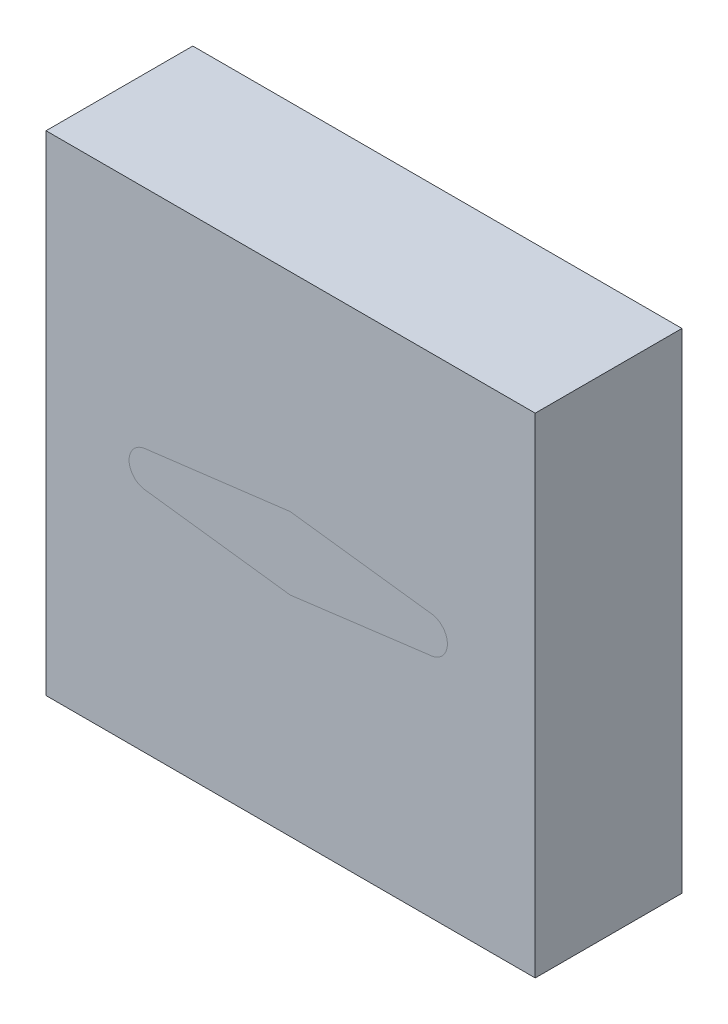
ISO-10303-21;
HEADER;
FILE_DESCRIPTION(('STEP AP214'),'2;1');
FILE_NAME('part.step','',(''),(''),'','','');
FILE_SCHEMA(('AUTOMOTIVE_DESIGN { 1 0 10303 214 1 1 1 1 }'));
ENDSEC;
DATA;
#1=APPLICATION_CONTEXT('core data for automotive mechanical design processes');
#2=APPLICATION_PROTOCOL_DEFINITION('international standard','automotive_design',2000,#1);
#3=PRODUCT_CONTEXT('',#1,'mechanical');
#4=PRODUCT('Part','Part','',(#3));
#5=PRODUCT_RELATED_PRODUCT_CATEGORY('part','',(#4));
#6=PRODUCT_DEFINITION_FORMATION('','',#4);
#7=PRODUCT_DEFINITION_CONTEXT('part definition',#1,'design');
#8=PRODUCT_DEFINITION('design','',#6,#7);
#9=PRODUCT_DEFINITION_SHAPE('','',#8);
#10=(LENGTH_UNIT() NAMED_UNIT(*) SI_UNIT(.MILLI.,.METRE.));
#11=(NAMED_UNIT(*) PLANE_ANGLE_UNIT() SI_UNIT($,.RADIAN.));
#12=(NAMED_UNIT(*) SI_UNIT($,.STERADIAN.) SOLID_ANGLE_UNIT());
#13=UNCERTAINTY_MEASURE_WITH_UNIT(LENGTH_MEASURE(1.E-05),#10,'distance_accuracy_value','');
#14=(GEOMETRIC_REPRESENTATION_CONTEXT(3) GLOBAL_UNCERTAINTY_ASSIGNED_CONTEXT((#13)) GLOBAL_UNIT_ASSIGNED_CONTEXT((#10,
#11,#12)) REPRESENTATION_CONTEXT('',''));
#15=CARTESIAN_POINT('',(0.,0.,0.));
#16=DIRECTION('',(0.,0.,1.));
#17=DIRECTION('',(1.,0.,0.));
#18=AXIS2_PLACEMENT_3D('',#15,#16,#17);
#19=CARTESIAN_POINT('',(14.1359581205412,0.0793616319379534,5.));
#20=DIRECTION('',(0.,0.,1.));
#21=DIRECTION('',(1.,0.,0.));
#22=AXIS2_PLACEMENT_3D('',#19,#20,#21);
#23=CYLINDRICAL_SURFACE('',#22,1.89099625638504);
#24=CARTESIAN_POINT('',(14.1359581205412,0.0793616319379534,15.));
#25=DIRECTION('',(0.,0.,1.));
#26=DIRECTION('',(1.,0.,0.));
#27=AXIS2_PLACEMENT_3D('',#24,#25,#26);
#28=CIRCLE('',#27,1.89099625638504);
#29=CARTESIAN_POINT('',(14.1639756358805,-1.8114270554876,15.));
#30=VERTEX_POINT('',#29);
#31=CARTESIAN_POINT('',(14.1404740770378,1.97035249595585,15.));
#32=VERTEX_POINT('',#31);
#33=EDGE_CURVE('E133',#30,#32,#28,.T.);
#34=ORIENTED_EDGE('',*,*,#33,.F.);
#35=DIRECTION('',(0.,0.,1.));
#36=VECTOR('',#35,1.);
#37=CARTESIAN_POINT('',(14.1639756358805,-1.8114270554876,5.));
#38=LINE('',#37,#36);
#39=CARTESIAN_POINT('',(14.1639756358805,-1.8114270554876,5.));
#40=VERTEX_POINT('',#39);
#41=EDGE_CURVE('E12',#40,#30,#38,.T.);
#42=ORIENTED_EDGE('',*,*,#41,.F.);
#43=CARTESIAN_POINT('',(14.1359581205412,0.0793616319379534,5.));
#44=DIRECTION('',(0.,0.,1.));
#45=DIRECTION('',(1.,0.,0.));
#46=AXIS2_PLACEMENT_3D('',#43,#44,#45);
#47=CIRCLE('',#46,1.89099625638504);
#48=CARTESIAN_POINT('',(14.1404740770378,1.97035249595585,5.));
#49=VERTEX_POINT('',#48);
#50=EDGE_CURVE('E147',#40,#49,#47,.T.);
#51=ORIENTED_EDGE('',*,*,#50,.T.);
#52=DIRECTION('',(0.,0.,1.));
#53=VECTOR('',#52,1.);
#54=CARTESIAN_POINT('',(14.1404740770378,1.97035249595585,5.));
#55=LINE('',#54,#53);
#56=EDGE_CURVE('E51',#49,#32,#55,.T.);
#57=ORIENTED_EDGE('',*,*,#56,.T.);
#58=EDGE_LOOP('',(#34,#42,#51,#57));
#59=FACE_BOUND('',#58,.T.);
#60=ADVANCED_FACE('F48',(#59),#23,.T.);
#61=CARTESIAN_POINT('',(-0.0477755509189492,-3.62218398577053,5.));
#62=DIRECTION('',(0.126390870058841,-0.991980517936602,0.));
#63=DIRECTION('',(0.991980517936602,0.126390870058841,0.));
#64=AXIS2_PLACEMENT_3D('',#61,#62,#63);
#65=PLANE('',#64);
#66=DIRECTION('',(0.991980517936602,0.126390870058841,0.));
#67=VECTOR('',#66,1.);
#68=CARTESIAN_POINT('',(-0.0477755509189492,-3.62218398577053,15.));
#69=LINE('',#68,#67);
#70=CARTESIAN_POINT('',(-0.0477755509189492,-3.62218398577053,15.));
#71=VERTEX_POINT('',#70);
#72=EDGE_CURVE('E145',#71,#30,#69,.T.);
#73=ORIENTED_EDGE('',*,*,#72,.F.);
#74=DIRECTION('',(0.,0.,1.));
#75=VECTOR('',#74,1.);
#76=CARTESIAN_POINT('',(-0.0477755509189492,-3.62218398577053,5.));
#77=LINE('',#76,#75);
#78=CARTESIAN_POINT('',(-0.0477755509189492,-3.62218398577053,5.));
#79=VERTEX_POINT('',#78);
#80=EDGE_CURVE('E57',#79,#71,#77,.T.);
#81=ORIENTED_EDGE('',*,*,#80,.F.);
#82=DIRECTION('',(0.991980517936602,0.126390870058841,0.));
#83=VECTOR('',#82,1.);
#84=CARTESIAN_POINT('',(-0.0477755509189492,-3.62218398577053,5.));
#85=LINE('',#84,#83);
#86=EDGE_CURVE('E123',#79,#40,#85,.T.);
#87=ORIENTED_EDGE('',*,*,#86,.T.);
#88=ORIENTED_EDGE('',*,*,#41,.T.);
#89=EDGE_LOOP('',(#73,#81,#87,#88));
#90=FACE_BOUND('',#89,.T.);
#91=ADVANCED_FACE('F155',(#90),#65,.T.);
#92=CARTESIAN_POINT('',(-14.7859527760631,-1.74496373019458,5.));
#93=DIRECTION('',(-0.126350467559565,-0.991985664890113,0.));
#94=DIRECTION('',(0.991985664890113,-0.126350467559565,0.));
#95=AXIS2_PLACEMENT_3D('',#92,#93,#94);
#96=PLANE('',#95);
#97=DIRECTION('',(0.991985664890113,-0.126350467559565,0.));
#98=VECTOR('',#97,1.);
#99=CARTESIAN_POINT('',(-14.7859527760631,-1.74496373019458,15.));
#100=LINE('',#99,#98);
#101=CARTESIAN_POINT('',(-14.7859527760631,-1.74496373019458,15.));
#102=VERTEX_POINT('',#101);
#103=EDGE_CURVE('E110',#102,#71,#100,.T.);
#104=ORIENTED_EDGE('',*,*,#103,.F.);
#105=DIRECTION('',(0.,0.,1.));
#106=VECTOR('',#105,1.);
#107=CARTESIAN_POINT('',(-14.7859527760631,-1.74496373019458,5.));
#108=LINE('',#107,#106);
#109=CARTESIAN_POINT('',(-14.7859527760631,-1.74496373019458,5.));
#110=VERTEX_POINT('',#109);
#111=EDGE_CURVE('E105',#110,#102,#108,.T.);
#112=ORIENTED_EDGE('',*,*,#111,.F.);
#113=DIRECTION('',(0.991985664890113,-0.126350467559565,0.));
#114=VECTOR('',#113,1.);
#115=CARTESIAN_POINT('',(-14.7859527760631,-1.74496373019458,5.));
#116=LINE('',#115,#114);
#117=EDGE_CURVE('E108',#110,#79,#116,.T.);
#118=ORIENTED_EDGE('',*,*,#117,.T.);
#119=ORIENTED_EDGE('',*,*,#80,.T.);
#120=EDGE_LOOP('',(#104,#112,#118,#119));
#121=FACE_BOUND('',#120,.T.);
#122=ADVANCED_FACE('F107',(#121),#96,.T.);
#123=CARTESIAN_POINT('',(-14.671886631999,0.0920626567636126,5.));
#124=DIRECTION('',(0.,0.,1.));
#125=DIRECTION('',(1.,0.,0.));
#126=AXIS2_PLACEMENT_3D('',#123,#124,#125);
#127=CYLINDRICAL_SURFACE('',#126,1.84056432422296);
#128=CARTESIAN_POINT('',(-14.671886631999,0.0920626567636126,15.));
#129=DIRECTION('',(0.,0.,1.));
#130=DIRECTION('',(1.,0.,0.));
#131=AXIS2_PLACEMENT_3D('',#128,#129,#130);
#132=CIRCLE('',#131,1.84056432422296);
#133=CARTESIAN_POINT('',(-14.8211705106121,1.92656295798696,15.));
#134=VERTEX_POINT('',#133);
#135=EDGE_CURVE('E142',#134,#102,#132,.T.);
#136=ORIENTED_EDGE('',*,*,#135,.F.);
#137=DIRECTION('',(0.,0.,1.));
#138=VECTOR('',#137,1.);
#139=CARTESIAN_POINT('',(-14.8211705106121,1.92656295798696,5.));
#140=LINE('',#139,#138);
#141=CARTESIAN_POINT('',(-14.8211705106121,1.92656295798696,5.));
#142=VERTEX_POINT('',#141);
#143=EDGE_CURVE('E115',#142,#134,#140,.T.);
#144=ORIENTED_EDGE('',*,*,#143,.F.);
#145=CARTESIAN_POINT('',(-14.671886631999,0.0920626567636126,5.));
#146=DIRECTION('',(0.,0.,1.));
#147=DIRECTION('',(1.,0.,0.));
#148=AXIS2_PLACEMENT_3D('',#145,#146,#147);
#149=CIRCLE('',#148,1.84056432422296);
#150=EDGE_CURVE('E121',#142,#110,#149,.T.);
#151=ORIENTED_EDGE('',*,*,#150,.T.);
#152=ORIENTED_EDGE('',*,*,#111,.T.);
#153=EDGE_LOOP('',(#136,#144,#151,#152));
#154=FACE_BOUND('',#153,.T.);
#155=ADVANCED_FACE('F125',(#154),#127,.T.);
#156=CARTESIAN_POINT('',(-0.0477755509189492,3.76551063852763,5.));
#157=DIRECTION('',(-0.123523694522528,0.992341623077207,0.));
#158=DIRECTION('',(-0.992341623077207,-0.123523694522528,0.));
#159=AXIS2_PLACEMENT_3D('',#156,#157,#158);
#160=PLANE('',#159);
#161=DIRECTION('',(-0.992341623077207,-0.123523694522528,0.));
#162=VECTOR('',#161,1.);
#163=CARTESIAN_POINT('',(-0.0477755509189492,3.76551063852763,15.));
#164=LINE('',#163,#162);
#165=CARTESIAN_POINT('',(-0.0477755509189492,3.76551063852763,15.));
#166=VERTEX_POINT('',#165);
#167=EDGE_CURVE('E139',#166,#134,#164,.T.);
#168=ORIENTED_EDGE('',*,*,#167,.F.);
#169=DIRECTION('',(0.,0.,1.));
#170=VECTOR('',#169,1.);
#171=CARTESIAN_POINT('',(-0.0477755509189492,3.76551063852763,5.));
#172=LINE('',#171,#170);
#173=CARTESIAN_POINT('',(-0.0477755509189492,3.76551063852763,5.));
#174=VERTEX_POINT('',#173);
#175=EDGE_CURVE('E150',#174,#166,#172,.T.);
#176=ORIENTED_EDGE('',*,*,#175,.F.);
#177=DIRECTION('',(-0.992341623077207,-0.123523694522528,0.));
#178=VECTOR('',#177,1.);
#179=CARTESIAN_POINT('',(-0.0477755509189492,3.76551063852763,5.));
#180=LINE('',#179,#178);
#181=EDGE_CURVE('E126',#174,#142,#180,.T.);
#182=ORIENTED_EDGE('',*,*,#181,.T.);
#183=ORIENTED_EDGE('',*,*,#143,.T.);
#184=EDGE_LOOP('',(#168,#176,#182,#183));
#185=FACE_BOUND('',#184,.T.);
#186=ADVANCED_FACE('F168',(#185),#160,.T.);
#187=CARTESIAN_POINT('',(14.1404740770378,1.97035249595585,5.));
#188=DIRECTION('',(0.125523558973591,0.99209063907619,0.));
#189=DIRECTION('',(-0.99209063907619,0.125523558973591,0.));
#190=AXIS2_PLACEMENT_3D('',#187,#188,#189);
#191=PLANE('',#190);
#192=DIRECTION('',(-0.99209063907619,0.125523558973591,0.));
#193=VECTOR('',#192,1.);
#194=CARTESIAN_POINT('',(14.1404740770378,1.97035249595585,15.));
#195=LINE('',#194,#193);
#196=EDGE_CURVE('E136',#32,#166,#195,.T.);
#197=ORIENTED_EDGE('',*,*,#196,.F.);
#198=ORIENTED_EDGE('',*,*,#56,.F.);
#199=DIRECTION('',(-0.99209063907619,0.125523558973591,0.));
#200=VECTOR('',#199,1.);
#201=CARTESIAN_POINT('',(14.1404740770378,1.97035249595585,5.));
#202=LINE('',#201,#200);
#203=EDGE_CURVE('E128',#49,#174,#202,.T.);
#204=ORIENTED_EDGE('',*,*,#203,.T.);
#205=ORIENTED_EDGE('',*,*,#175,.T.);
#206=EDGE_LOOP('',(#197,#198,#204,#205));
#207=FACE_BOUND('',#206,.T.);
#208=ADVANCED_FACE('F152',(#207),#191,.T.);
#209=CARTESIAN_POINT('',(14.1359581205412,0.0793616319379534,5.));
#210=DIRECTION('',(0.,0.,1.));
#211=DIRECTION('',(1.,0.,0.));
#212=AXIS2_PLACEMENT_3D('',#209,#210,#211);
#213=PLANE('',#212);
#214=ORIENTED_EDGE('',*,*,#50,.F.);
#215=ORIENTED_EDGE('',*,*,#86,.F.);
#216=ORIENTED_EDGE('',*,*,#117,.F.);
#217=ORIENTED_EDGE('',*,*,#150,.F.);
#218=ORIENTED_EDGE('',*,*,#181,.F.);
#219=ORIENTED_EDGE('',*,*,#203,.F.);
#220=EDGE_LOOP('',(#214,#215,#216,#217,#218,#219));
#221=FACE_BOUND('',#220,.T.);
#222=ADVANCED_FACE('F119',(#221),#213,.F.);
#223=CARTESIAN_POINT('',(14.1359581205412,0.0793616319379534,15.));
#224=DIRECTION('',(0.,0.,1.));
#225=DIRECTION('',(1.,0.,0.));
#226=AXIS2_PLACEMENT_3D('',#223,#224,#225);
#227=PLANE('',#226);
#228=ORIENTED_EDGE('',*,*,#33,.T.);
#229=ORIENTED_EDGE('',*,*,#196,.T.);
#230=ORIENTED_EDGE('',*,*,#167,.T.);
#231=ORIENTED_EDGE('',*,*,#135,.T.);
#232=ORIENTED_EDGE('',*,*,#103,.T.);
#233=ORIENTED_EDGE('',*,*,#72,.T.);
#234=EDGE_LOOP('',(#228,#229,#230,#231,#232,#233));
#235=FACE_BOUND('',#234,.T.);
#236=ADVANCED_FACE('F154',(#235),#227,.T.);
#237=CLOSED_SHELL('',(#60,#91,#122,#155,#186,#208,#222,#236));
#238=MANIFOLD_SOLID_BREP('B2',#237);
#239=CARTESIAN_POINT('',(25.,25.,15.));
#240=DIRECTION('',(-1.,0.,0.));
#241=DIRECTION('',(0.,0.,1.));
#242=AXIS2_PLACEMENT_3D('',#239,#240,#241);
#243=PLANE('',#242);
#244=DIRECTION('',(0.,1.,0.));
#245=VECTOR('',#244,1.);
#246=CARTESIAN_POINT('',(25.,25.,0.));
#247=LINE('',#246,#245);
#248=CARTESIAN_POINT('',(25.,-25.,0.));
#249=VERTEX_POINT('',#248);
#250=CARTESIAN_POINT('',(25.,25.,0.));
#251=VERTEX_POINT('',#250);
#252=EDGE_CURVE('E329',#249,#251,#247,.T.);
#253=ORIENTED_EDGE('',*,*,#252,.T.);
#254=DIRECTION('',(0.,0.,-1.));
#255=VECTOR('',#254,1.);
#256=CARTESIAN_POINT('',(25.,25.,15.));
#257=LINE('',#256,#255);
#258=CARTESIAN_POINT('',(25.,25.,15.));
#259=VERTEX_POINT('',#258);
#260=EDGE_CURVE('E46',#259,#251,#257,.T.);
#261=ORIENTED_EDGE('',*,*,#260,.F.);
#262=DIRECTION('',(0.,1.,0.));
#263=VECTOR('',#262,1.);
#264=CARTESIAN_POINT('',(25.,25.,15.));
#265=LINE('',#264,#263);
#266=CARTESIAN_POINT('',(25.,-25.,15.));
#267=VERTEX_POINT('',#266);
#268=EDGE_CURVE('E364',#267,#259,#265,.T.);
#269=ORIENTED_EDGE('',*,*,#268,.F.);
#270=DIRECTION('',(0.,0.,-1.));
#271=VECTOR('',#270,1.);
#272=CARTESIAN_POINT('',(25.,-25.,15.));
#273=LINE('',#272,#271);
#274=EDGE_CURVE('E374',#267,#249,#273,.T.);
#275=ORIENTED_EDGE('',*,*,#274,.T.);
#276=EDGE_LOOP('',(#253,#261,#269,#275));
#277=FACE_BOUND('',#276,.T.);
#278=ADVANCED_FACE('F239',(#277),#243,.F.);
#279=CARTESIAN_POINT('',(-25.,25.,15.));
#280=DIRECTION('',(0.,-1.,0.));
#281=DIRECTION('',(0.,0.,-1.));
#282=AXIS2_PLACEMENT_3D('',#279,#280,#281);
#283=PLANE('',#282);
#284=DIRECTION('',(-1.,0.,0.));
#285=VECTOR('',#284,1.);
#286=CARTESIAN_POINT('',(-25.,25.,0.));
#287=LINE('',#286,#285);
#288=CARTESIAN_POINT('',(-25.,25.,0.));
#289=VERTEX_POINT('',#288);
#290=EDGE_CURVE('E377',#251,#289,#287,.T.);
#291=ORIENTED_EDGE('',*,*,#290,.T.);
#292=DIRECTION('',(0.,0.,-1.));
#293=VECTOR('',#292,1.);
#294=CARTESIAN_POINT('',(-25.,25.,15.));
#295=LINE('',#294,#293);
#296=CARTESIAN_POINT('',(-25.,25.,15.));
#297=VERTEX_POINT('',#296);
#298=EDGE_CURVE('E246',#297,#289,#295,.T.);
#299=ORIENTED_EDGE('',*,*,#298,.F.);
#300=DIRECTION('',(-1.,0.,0.));
#301=VECTOR('',#300,1.);
#302=CARTESIAN_POINT('',(-25.,25.,15.));
#303=LINE('',#302,#301);
#304=EDGE_CURVE('E367',#259,#297,#303,.T.);
#305=ORIENTED_EDGE('',*,*,#304,.F.);
#306=ORIENTED_EDGE('',*,*,#260,.T.);
#307=EDGE_LOOP('',(#291,#299,#305,#306));
#308=FACE_BOUND('',#307,.T.);
#309=ADVANCED_FACE('F405',(#308),#283,.F.);
#310=CARTESIAN_POINT('',(-25.,25.,15.));
#311=DIRECTION('',(1.,0.,0.));
#312=DIRECTION('',(0.,1.,0.));
#313=AXIS2_PLACEMENT_3D('',#310,#311,#312);
#314=PLANE('',#313);
#315=DIRECTION('',(0.,-1.,0.));
#316=VECTOR('',#315,1.);
#317=CARTESIAN_POINT('',(-25.,25.,0.));
#318=LINE('',#317,#316);
#319=CARTESIAN_POINT('',(-25.,-25.,0.));
#320=VERTEX_POINT('',#319);
#321=EDGE_CURVE('E379',#289,#320,#318,.T.);
#322=ORIENTED_EDGE('',*,*,#321,.T.);
#323=DIRECTION('',(0.,0.,-1.));
#324=VECTOR('',#323,1.);
#325=CARTESIAN_POINT('',(-25.,-25.,15.));
#326=LINE('',#325,#324);
#327=CARTESIAN_POINT('',(-25.,-25.,15.));
#328=VERTEX_POINT('',#327);
#329=EDGE_CURVE('E384',#328,#320,#326,.T.);
#330=ORIENTED_EDGE('',*,*,#329,.F.);
#331=DIRECTION('',(0.,-1.,0.));
#332=VECTOR('',#331,1.);
#333=CARTESIAN_POINT('',(-25.,25.,15.));
#334=LINE('',#333,#332);
#335=EDGE_CURVE('E370',#297,#328,#334,.T.);
#336=ORIENTED_EDGE('',*,*,#335,.F.);
#337=ORIENTED_EDGE('',*,*,#298,.T.);
#338=EDGE_LOOP('',(#322,#330,#336,#337));
#339=FACE_BOUND('',#338,.T.);
#340=ADVANCED_FACE('F391',(#339),#314,.F.);
#341=CARTESIAN_POINT('',(-25.,-25.,15.));
#342=DIRECTION('',(0.,1.,0.));
#343=DIRECTION('',(0.,0.,1.));
#344=AXIS2_PLACEMENT_3D('',#341,#342,#343);
#345=PLANE('',#344);
#346=DIRECTION('',(1.,0.,0.));
#347=VECTOR('',#346,1.);
#348=CARTESIAN_POINT('',(-25.,-25.,0.));
#349=LINE('',#348,#347);
#350=EDGE_CURVE('E368',#320,#249,#349,.T.);
#351=ORIENTED_EDGE('',*,*,#350,.T.);
#352=ORIENTED_EDGE('',*,*,#274,.F.);
#353=DIRECTION('',(1.,0.,0.));
#354=VECTOR('',#353,1.);
#355=CARTESIAN_POINT('',(-25.,-25.,15.));
#356=LINE('',#355,#354);
#357=EDGE_CURVE('E372',#328,#267,#356,.T.);
#358=ORIENTED_EDGE('',*,*,#357,.F.);
#359=ORIENTED_EDGE('',*,*,#329,.T.);
#360=EDGE_LOOP('',(#351,#352,#358,#359));
#361=FACE_BOUND('',#360,.T.);
#362=ADVANCED_FACE('F398',(#361),#345,.F.);
#363=CARTESIAN_POINT('',(0.,0.,15.));
#364=DIRECTION('',(0.,0.,1.));
#365=DIRECTION('',(1.,0.,0.));
#366=AXIS2_PLACEMENT_3D('',#363,#364,#365);
#367=PLANE('',#366);
#368=CARTESIAN_POINT('',(-14.671886631999,0.0920626567636126,15.));
#369=DIRECTION('',(0.,0.,1.));
#370=DIRECTION('',(1.,0.,0.));
#371=AXIS2_PLACEMENT_3D('',#368,#369,#370);
#372=CIRCLE('',#371,1.84056432422296);
#373=CARTESIAN_POINT('',(-14.8211705106121,1.92656295798696,15.));
#374=VERTEX_POINT('',#373);
#375=CARTESIAN_POINT('',(-14.7859527760631,-1.74496373019458,15.));
#376=VERTEX_POINT('',#375);
#377=EDGE_CURVE('E253',#374,#376,#372,.T.);
#378=ORIENTED_EDGE('',*,*,#377,.F.);
#379=DIRECTION('',(-0.992341623077207,-0.123523694522528,0.));
#380=VECTOR('',#379,1.);
#381=CARTESIAN_POINT('',(-14.8211705106121,1.92656295798696,15.));
#382=LINE('',#381,#380);
#383=CARTESIAN_POINT('',(-0.0477755509189492,3.76551063852763,15.));
#384=VERTEX_POINT('',#383);
#385=EDGE_CURVE('E323',#384,#374,#382,.T.);
#386=ORIENTED_EDGE('',*,*,#385,.F.);
#387=DIRECTION('',(-0.99209063907619,0.125523558973591,0.));
#388=VECTOR('',#387,1.);
#389=CARTESIAN_POINT('',(-0.0477755509189492,3.76551063852763,15.));
#390=LINE('',#389,#388);
#391=CARTESIAN_POINT('',(14.1404740770378,1.97035249595585,15.));
#392=VERTEX_POINT('',#391);
#393=EDGE_CURVE('E351',#392,#384,#390,.T.);
#394=ORIENTED_EDGE('',*,*,#393,.F.);
#395=CARTESIAN_POINT('',(14.1359581205412,0.0793616319379534,15.));
#396=DIRECTION('',(0.,0.,1.));
#397=DIRECTION('',(1.,0.,0.));
#398=AXIS2_PLACEMENT_3D('',#395,#396,#397);
#399=CIRCLE('',#398,1.89099625638504);
#400=CARTESIAN_POINT('',(14.1639756358805,-1.8114270554876,15.));
#401=VERTEX_POINT('',#400);
#402=EDGE_CURVE('E348',#401,#392,#399,.T.);
#403=ORIENTED_EDGE('',*,*,#402,.F.);
#404=DIRECTION('',(0.991980517936602,0.126390870058841,0.));
#405=VECTOR('',#404,1.);
#406=CARTESIAN_POINT('',(-0.0477755509189492,-3.62218398577053,15.));
#407=LINE('',#406,#405);
#408=CARTESIAN_POINT('',(-0.0477755509189492,-3.62218398577053,15.));
#409=VERTEX_POINT('',#408);
#410=EDGE_CURVE('E345',#409,#401,#407,.T.);
#411=ORIENTED_EDGE('',*,*,#410,.F.);
#412=DIRECTION('',(0.991985664890113,-0.126350467559565,0.));
#413=VECTOR('',#412,1.);
#414=CARTESIAN_POINT('',(-14.7859527760631,-1.74496373019458,15.));
#415=LINE('',#414,#413);
#416=EDGE_CURVE('E338',#376,#409,#415,.T.);
#417=ORIENTED_EDGE('',*,*,#416,.F.);
#418=EDGE_LOOP('',(#378,#386,#394,#403,#411,#417));
#419=FACE_BOUND('',#418,.T.);
#420=ORIENTED_EDGE('',*,*,#268,.T.);
#421=ORIENTED_EDGE('',*,*,#304,.T.);
#422=ORIENTED_EDGE('',*,*,#335,.T.);
#423=ORIENTED_EDGE('',*,*,#357,.T.);
#424=EDGE_LOOP('',(#420,#421,#422,#423));
#425=FACE_BOUND('',#424,.T.);
#426=ADVANCED_FACE('F404',(#419,#425),#367,.T.);
#427=CARTESIAN_POINT('',(0.,0.,0.));
#428=DIRECTION('',(0.,0.,1.));
#429=DIRECTION('',(1.,0.,0.));
#430=AXIS2_PLACEMENT_3D('',#427,#428,#429);
#431=PLANE('',#430);
#432=DIRECTION('',(0.992341623077207,0.123523694522528,0.));
#433=VECTOR('',#432,1.);
#434=CARTESIAN_POINT('',(-14.8211705106121,1.92656295798696,0.));
#435=LINE('',#434,#433);
#436=CARTESIAN_POINT('',(-14.8211705106121,1.92656295798696,0.));
#437=VERTEX_POINT('',#436);
#438=CARTESIAN_POINT('',(-0.0477755509189492,3.76551063852763,0.));
#439=VERTEX_POINT('',#438);
#440=EDGE_CURVE('E336',#437,#439,#435,.T.);
#441=ORIENTED_EDGE('',*,*,#440,.F.);
#442=CARTESIAN_POINT('',(-14.671886631999,0.0920626567636126,0.));
#443=DIRECTION('',(0.,0.,1.));
#444=DIRECTION('',(1.,0.,0.));
#445=AXIS2_PLACEMENT_3D('',#442,#443,#444);
#446=CIRCLE('',#445,1.84056432422296);
#447=CARTESIAN_POINT('',(-14.7859527760631,-1.74496373019458,0.));
#448=VERTEX_POINT('',#447);
#449=EDGE_CURVE('E317',#448,#437,#446,.F.);
#450=ORIENTED_EDGE('',*,*,#449,.F.);
#451=DIRECTION('',(-0.991985664890113,0.126350467559565,0.));
#452=VECTOR('',#451,1.);
#453=CARTESIAN_POINT('',(-14.7859527760631,-1.74496373019458,0.));
#454=LINE('',#453,#452);
#455=CARTESIAN_POINT('',(-0.0477755509189492,-3.62218398577053,0.));
#456=VERTEX_POINT('',#455);
#457=EDGE_CURVE('E326',#456,#448,#454,.T.);
#458=ORIENTED_EDGE('',*,*,#457,.F.);
#459=DIRECTION('',(-0.991980517936602,-0.126390870058841,0.));
#460=VECTOR('',#459,1.);
#461=CARTESIAN_POINT('',(-0.0477755509189492,-3.62218398577053,0.));
#462=LINE('',#461,#460);
#463=CARTESIAN_POINT('',(14.1639756358805,-1.8114270554876,0.));
#464=VERTEX_POINT('',#463);
#465=EDGE_CURVE('E261',#464,#456,#462,.T.);
#466=ORIENTED_EDGE('',*,*,#465,.F.);
#467=CARTESIAN_POINT('',(14.1359581205412,0.0793616319379534,0.));
#468=DIRECTION('',(0.,0.,1.));
#469=DIRECTION('',(1.,0.,0.));
#470=AXIS2_PLACEMENT_3D('',#467,#468,#469);
#471=CIRCLE('',#470,1.89099625638504);
#472=CARTESIAN_POINT('',(14.1404740770378,1.97035249595585,0.));
#473=VERTEX_POINT('',#472);
#474=EDGE_CURVE('E443',#473,#464,#471,.F.);
#475=ORIENTED_EDGE('',*,*,#474,.F.);
#476=DIRECTION('',(0.99209063907619,-0.125523558973591,0.));
#477=VECTOR('',#476,1.);
#478=CARTESIAN_POINT('',(-0.0477755509189492,3.76551063852763,0.));
#479=LINE('',#478,#477);
#480=EDGE_CURVE('E340',#439,#473,#479,.T.);
#481=ORIENTED_EDGE('',*,*,#480,.F.);
#482=EDGE_LOOP('',(#441,#450,#458,#466,#475,#481));
#483=FACE_BOUND('',#482,.T.);
#484=ORIENTED_EDGE('',*,*,#252,.F.);
#485=ORIENTED_EDGE('',*,*,#350,.F.);
#486=ORIENTED_EDGE('',*,*,#321,.F.);
#487=ORIENTED_EDGE('',*,*,#290,.F.);
#488=EDGE_LOOP('',(#484,#485,#486,#487));
#489=FACE_BOUND('',#488,.T.);
#490=ADVANCED_FACE('F332',(#483,#489),#431,.F.);
#491=CARTESIAN_POINT('',(-14.671886631999,0.0920626567636126,-0.000999999999999265));
#492=DIRECTION('',(0.,0.,1.));
#493=DIRECTION('',(1.,0.,0.));
#494=AXIS2_PLACEMENT_3D('',#491,#492,#493);
#495=CYLINDRICAL_SURFACE('',#494,1.84056432422296);
#496=ORIENTED_EDGE('',*,*,#449,.T.);
#497=DIRECTION('',(0.,0.,1.));
#498=VECTOR('',#497,1.);
#499=CARTESIAN_POINT('',(-14.8211705106121,1.92656295798696,-0.000999999999999265));
#500=LINE('',#499,#498);
#501=EDGE_CURVE('E330',#437,#374,#500,.T.);
#502=ORIENTED_EDGE('',*,*,#501,.T.);
#503=ORIENTED_EDGE('',*,*,#377,.T.);
#504=DIRECTION('',(0.,0.,1.));
#505=VECTOR('',#504,1.);
#506=CARTESIAN_POINT('',(-14.7859527760631,-1.74496373019458,-0.000999999999999265));
#507=LINE('',#506,#505);
#508=EDGE_CURVE('E313',#448,#376,#507,.T.);
#509=ORIENTED_EDGE('',*,*,#508,.F.);
#510=EDGE_LOOP('',(#496,#502,#503,#509));
#511=FACE_BOUND('',#510,.T.);
#512=ADVANCED_FACE('F315',(#511),#495,.F.);
#513=CARTESIAN_POINT('',(-14.8211705106121,1.92656295798696,-0.000999999999999265));
#514=DIRECTION('',(-0.123523694522528,0.992341623077207,0.));
#515=DIRECTION('',(-0.992341623077207,-0.123523694522528,0.));
#516=AXIS2_PLACEMENT_3D('',#513,#514,#515);
#517=PLANE('',#516);
#518=ORIENTED_EDGE('',*,*,#440,.T.);
#519=DIRECTION('',(0.,0.,1.));
#520=VECTOR('',#519,1.);
#521=CARTESIAN_POINT('',(-0.0477755509189492,3.76551063852763,-0.000999999999999265));
#522=LINE('',#521,#520);
#523=EDGE_CURVE('E357',#439,#384,#522,.T.);
#524=ORIENTED_EDGE('',*,*,#523,.T.);
#525=ORIENTED_EDGE('',*,*,#385,.T.);
#526=ORIENTED_EDGE('',*,*,#501,.F.);
#527=EDGE_LOOP('',(#518,#524,#525,#526));
#528=FACE_BOUND('',#527,.T.);
#529=ADVANCED_FACE('F422',(#528),#517,.F.);
#530=CARTESIAN_POINT('',(-0.0477755509189492,3.76551063852763,-0.000999999999999265));
#531=DIRECTION('',(0.125523558973591,0.99209063907619,0.));
#532=DIRECTION('',(-0.99209063907619,0.125523558973591,0.));
#533=AXIS2_PLACEMENT_3D('',#530,#531,#532);
#534=PLANE('',#533);
#535=ORIENTED_EDGE('',*,*,#480,.T.);
#536=DIRECTION('',(0.,0.,1.));
#537=VECTOR('',#536,1.);
#538=CARTESIAN_POINT('',(14.1404740770378,1.97035249595585,-0.000999999999999265));
#539=LINE('',#538,#537);
#540=EDGE_CURVE('E359',#473,#392,#539,.T.);
#541=ORIENTED_EDGE('',*,*,#540,.T.);
#542=ORIENTED_EDGE('',*,*,#393,.T.);
#543=ORIENTED_EDGE('',*,*,#523,.F.);
#544=EDGE_LOOP('',(#535,#541,#542,#543));
#545=FACE_BOUND('',#544,.T.);
#546=ADVANCED_FACE('F431',(#545),#534,.F.);
#547=CARTESIAN_POINT('',(14.1359581205412,0.0793616319379534,-0.000999999999999265));
#548=DIRECTION('',(0.,0.,1.));
#549=DIRECTION('',(1.,0.,0.));
#550=AXIS2_PLACEMENT_3D('',#547,#548,#549);
#551=CYLINDRICAL_SURFACE('',#550,1.89099625638504);
#552=ORIENTED_EDGE('',*,*,#474,.T.);
#553=DIRECTION('',(0.,0.,1.));
#554=VECTOR('',#553,1.);
#555=CARTESIAN_POINT('',(14.1639756358805,-1.8114270554876,-0.000999999999999265));
#556=LINE('',#555,#554);
#557=EDGE_CURVE('E361',#464,#401,#556,.T.);
#558=ORIENTED_EDGE('',*,*,#557,.T.);
#559=ORIENTED_EDGE('',*,*,#402,.T.);
#560=ORIENTED_EDGE('',*,*,#540,.F.);
#561=EDGE_LOOP('',(#552,#558,#559,#560));
#562=FACE_BOUND('',#561,.T.);
#563=ADVANCED_FACE('F428',(#562),#551,.F.);
#564=CARTESIAN_POINT('',(-0.0477755509189492,-3.62218398577053,-0.000999999999999265));
#565=DIRECTION('',(0.126390870058841,-0.991980517936602,0.));
#566=DIRECTION('',(0.991980517936602,0.126390870058841,0.));
#567=AXIS2_PLACEMENT_3D('',#564,#565,#566);
#568=PLANE('',#567);
#569=ORIENTED_EDGE('',*,*,#465,.T.);
#570=DIRECTION('',(0.,0.,1.));
#571=VECTOR('',#570,1.);
#572=CARTESIAN_POINT('',(-0.0477755509189492,-3.62218398577053,-0.000999999999999265));
#573=LINE('',#572,#571);
#574=EDGE_CURVE('E322',#456,#409,#573,.T.);
#575=ORIENTED_EDGE('',*,*,#574,.T.);
#576=ORIENTED_EDGE('',*,*,#410,.T.);
#577=ORIENTED_EDGE('',*,*,#557,.F.);
#578=EDGE_LOOP('',(#569,#575,#576,#577));
#579=FACE_BOUND('',#578,.T.);
#580=ADVANCED_FACE('F425',(#579),#568,.F.);
#581=CARTESIAN_POINT('',(-14.7859527760631,-1.74496373019458,-0.000999999999999265));
#582=DIRECTION('',(-0.126350467559565,-0.991985664890113,0.));
#583=DIRECTION('',(0.991985664890113,-0.126350467559565,0.));
#584=AXIS2_PLACEMENT_3D('',#581,#582,#583);
#585=PLANE('',#584);
#586=ORIENTED_EDGE('',*,*,#457,.T.);
#587=ORIENTED_EDGE('',*,*,#508,.T.);
#588=ORIENTED_EDGE('',*,*,#416,.T.);
#589=ORIENTED_EDGE('',*,*,#574,.F.);
#590=EDGE_LOOP('',(#586,#587,#588,#589));
#591=FACE_BOUND('',#590,.T.);
#592=ADVANCED_FACE('F327',(#591),#585,.F.);
#593=CLOSED_SHELL('',(#278,#309,#340,#362,#426,#490,#512,#529,#546,#563,#580,#592));
#594=MANIFOLD_SOLID_BREP('B6',#593);
#595=ADVANCED_BREP_SHAPE_REPRESENTATION('',(#18,#238,#594),#14);
#596=SHAPE_DEFINITION_REPRESENTATION(#9,#595);
ENDSEC;
END-ISO-10303-21;
